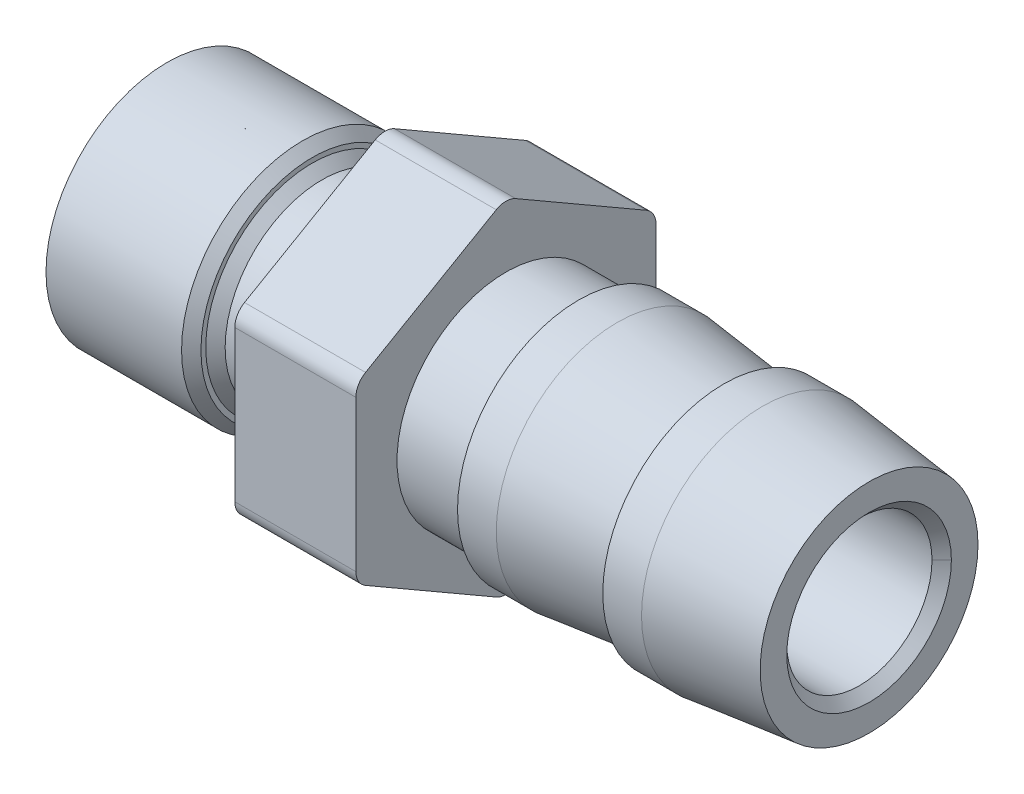
ISO-10303-21;
HEADER;
FILE_DESCRIPTION(('STEP AP214'),'2;1');
FILE_NAME('part.step','',(''),(''),'','','');
FILE_SCHEMA(('AUTOMOTIVE_DESIGN { 1 0 10303 214 1 1 1 1 }'));
ENDSEC;
DATA;
#1=APPLICATION_CONTEXT('core data for automotive mechanical design processes');
#2=APPLICATION_PROTOCOL_DEFINITION('international standard','automotive_design',2000,#1);
#3=PRODUCT_CONTEXT('',#1,'mechanical');
#4=PRODUCT('Part','Part','',(#3));
#5=PRODUCT_RELATED_PRODUCT_CATEGORY('part','',(#4));
#6=PRODUCT_DEFINITION_FORMATION('','',#4);
#7=PRODUCT_DEFINITION_CONTEXT('part definition',#1,'design');
#8=PRODUCT_DEFINITION('design','',#6,#7);
#9=PRODUCT_DEFINITION_SHAPE('','',#8);
#10=(LENGTH_UNIT() NAMED_UNIT(*) SI_UNIT(.MILLI.,.METRE.));
#11=(NAMED_UNIT(*) PLANE_ANGLE_UNIT() SI_UNIT($,.RADIAN.));
#12=(NAMED_UNIT(*) SI_UNIT($,.STERADIAN.) SOLID_ANGLE_UNIT());
#13=UNCERTAINTY_MEASURE_WITH_UNIT(LENGTH_MEASURE(1.E-05),#10,'distance_accuracy_value','');
#14=(GEOMETRIC_REPRESENTATION_CONTEXT(3) GLOBAL_UNCERTAINTY_ASSIGNED_CONTEXT((#13)) GLOBAL_UNIT_ASSIGNED_CONTEXT((#10,
#11,#12)) REPRESENTATION_CONTEXT('',''));
#15=CARTESIAN_POINT('',(0.,0.,0.));
#16=DIRECTION('',(0.,0.,1.));
#17=DIRECTION('',(1.,0.,0.));
#18=AXIS2_PLACEMENT_3D('',#15,#16,#17);
#19=CARTESIAN_POINT('',(10.,0.,0.));
#20=DIRECTION('',(1.,0.,0.));
#21=DIRECTION('',(0.,-1.,0.));
#22=AXIS2_PLACEMENT_3D('',#19,#20,#21);
#23=PLANE('',#22);
#24=CARTESIAN_POINT('',(10.,0.,0.));
#25=DIRECTION('',(-1.,0.,0.));
#26=DIRECTION('',(0.,0.,-1.));
#27=AXIS2_PLACEMENT_3D('',#24,#25,#26);
#28=CIRCLE('',#27,2.25);
#29=CARTESIAN_POINT('',(10.,0.,-2.25));
#30=VERTEX_POINT('',#29);
#31=EDGE_CURVE('E25',#30,#30,#28,.T.);
#32=ORIENTED_EDGE('',*,*,#31,.F.);
#33=EDGE_LOOP('',(#32));
#34=FACE_BOUND('',#33,.T.);
#35=CARTESIAN_POINT('',(10.,0.,0.));
#36=DIRECTION('',(-1.,0.,0.));
#37=DIRECTION('',(0.,0.,1.));
#38=AXIS2_PLACEMENT_3D('',#35,#36,#37);
#39=CIRCLE('',#38,1.7);
#40=CARTESIAN_POINT('',(10.,0.,1.7));
#41=VERTEX_POINT('',#40);
#42=CARTESIAN_POINT('',(10.,0.,-1.7));
#43=VERTEX_POINT('',#42);
#44=EDGE_CURVE('E44',#41,#43,#39,.T.);
#45=ORIENTED_EDGE('',*,*,#44,.T.);
#46=CARTESIAN_POINT('',(10.,0.,0.));
#47=DIRECTION('',(-1.,0.,0.));
#48=DIRECTION('',(0.,0.,-1.));
#49=AXIS2_PLACEMENT_3D('',#46,#47,#48);
#50=CIRCLE('',#49,1.7);
#51=EDGE_CURVE('E235',#43,#41,#50,.T.);
#52=ORIENTED_EDGE('',*,*,#51,.T.);
#53=EDGE_LOOP('',(#45,#52));
#54=FACE_BOUND('',#53,.T.);
#55=ADVANCED_FACE('F16',(#34,#54),#23,.T.);
#56=CARTESIAN_POINT('',(10.,0.,0.));
#57=DIRECTION('',(-1.,0.,0.));
#58=DIRECTION('',(0.,0.,-1.));
#59=AXIS2_PLACEMENT_3D('',#56,#57,#58);
#60=CONICAL_SURFACE('',#59,2.25,0.11315098159);
#61=ORIENTED_EDGE('',*,*,#31,.T.);
#62=DIRECTION('',(-0.993605254789754,0.,-0.112909688043972));
#63=VECTOR('',#62,1.);
#64=CARTESIAN_POINT('',(10.,0.,-2.25));
#65=LINE('',#64,#63);
#66=CARTESIAN_POINT('',(7.8,0.,-2.5));
#67=VERTEX_POINT('',#66);
#68=EDGE_CURVE('E10',#30,#67,#65,.T.);
#69=ORIENTED_EDGE('',*,*,#68,.T.);
#70=CARTESIAN_POINT('',(7.8,0.,0.));
#71=DIRECTION('',(-1.,0.,0.));
#72=DIRECTION('',(0.,0.,-1.));
#73=AXIS2_PLACEMENT_3D('',#70,#71,#72);
#74=CIRCLE('',#73,2.5);
#75=EDGE_CURVE('E281',#67,#67,#74,.T.);
#76=ORIENTED_EDGE('',*,*,#75,.F.);
#77=ORIENTED_EDGE('',*,*,#68,.F.);
#78=EDGE_LOOP('',(#61,#69,#76,#77));
#79=FACE_BOUND('',#78,.T.);
#80=ADVANCED_FACE('F18',(#79),#60,.T.);
#81=CARTESIAN_POINT('',(9.8,0.,0.));
#82=DIRECTION('',(1.,0.,0.));
#83=DIRECTION('',(0.,0.,1.));
#84=AXIS2_PLACEMENT_3D('',#81,#82,#83);
#85=CONICAL_SURFACE('',#84,1.5,0.785398163397);
#86=DIRECTION('',(0.707106781186548,0.,0.707106781186548));
#87=VECTOR('',#86,1.);
#88=CARTESIAN_POINT('',(9.8,0.,1.5));
#89=LINE('',#88,#87);
#90=CARTESIAN_POINT('',(9.8,0.,1.5));
#91=VERTEX_POINT('',#90);
#92=EDGE_CURVE('E232',#91,#41,#89,.T.);
#93=ORIENTED_EDGE('',*,*,#92,.F.);
#94=CARTESIAN_POINT('',(9.8,0.,0.));
#95=DIRECTION('',(-1.,0.,0.));
#96=DIRECTION('',(0.,0.,1.));
#97=AXIS2_PLACEMENT_3D('',#94,#95,#96);
#98=CIRCLE('',#97,1.5);
#99=CARTESIAN_POINT('',(9.8,0.,-1.5));
#100=VERTEX_POINT('',#99);
#101=EDGE_CURVE('E274',#91,#100,#98,.T.);
#102=ORIENTED_EDGE('',*,*,#101,.T.);
#103=DIRECTION('',(0.707106781186548,0.,-0.707106781186548));
#104=VECTOR('',#103,1.);
#105=CARTESIAN_POINT('',(9.8,0.,-1.5));
#106=LINE('',#105,#104);
#107=EDGE_CURVE('E230',#100,#43,#106,.T.);
#108=ORIENTED_EDGE('',*,*,#107,.T.);
#109=ORIENTED_EDGE('',*,*,#44,.F.);
#110=EDGE_LOOP('',(#93,#102,#108,#109));
#111=FACE_BOUND('',#110,.T.);
#112=ADVANCED_FACE('F304',(#111),#85,.F.);
#113=CARTESIAN_POINT('',(9.8,0.,0.));
#114=DIRECTION('',(1.,0.,0.));
#115=DIRECTION('',(0.,0.,-1.));
#116=AXIS2_PLACEMENT_3D('',#113,#114,#115);
#117=CONICAL_SURFACE('',#116,1.5,0.785398163397);
#118=ORIENTED_EDGE('',*,*,#107,.F.);
#119=CARTESIAN_POINT('',(9.8,0.,0.));
#120=DIRECTION('',(-1.,0.,0.));
#121=DIRECTION('',(0.,0.,-1.));
#122=AXIS2_PLACEMENT_3D('',#119,#120,#121);
#123=CIRCLE('',#122,1.5);
#124=EDGE_CURVE('E273',#100,#91,#123,.T.);
#125=ORIENTED_EDGE('',*,*,#124,.T.);
#126=ORIENTED_EDGE('',*,*,#92,.T.);
#127=ORIENTED_EDGE('',*,*,#51,.F.);
#128=EDGE_LOOP('',(#118,#125,#126,#127));
#129=FACE_BOUND('',#128,.T.);
#130=ADVANCED_FACE('F302',(#129),#117,.F.);
#131=CARTESIAN_POINT('',(7.8,0.,0.));
#132=DIRECTION('',(-1.,0.,0.));
#133=DIRECTION('',(0.,0.,-1.));
#134=AXIS2_PLACEMENT_3D('',#131,#132,#133);
#135=CYLINDRICAL_SURFACE('',#134,2.5);
#136=ORIENTED_EDGE('',*,*,#75,.T.);
#137=DIRECTION('',(-1.,0.,0.));
#138=VECTOR('',#137,1.);
#139=CARTESIAN_POINT('',(7.8,0.,-2.5));
#140=LINE('',#139,#138);
#141=CARTESIAN_POINT('',(7.,0.,-2.5));
#142=VERTEX_POINT('',#141);
#143=EDGE_CURVE('E285',#67,#142,#140,.T.);
#144=ORIENTED_EDGE('',*,*,#143,.T.);
#145=CARTESIAN_POINT('',(7.,0.,0.));
#146=DIRECTION('',(-1.,0.,0.));
#147=DIRECTION('',(0.,0.,-1.));
#148=AXIS2_PLACEMENT_3D('',#145,#146,#147);
#149=CIRCLE('',#148,2.5);
#150=EDGE_CURVE('E267',#142,#142,#149,.T.);
#151=ORIENTED_EDGE('',*,*,#150,.F.);
#152=ORIENTED_EDGE('',*,*,#143,.F.);
#153=EDGE_LOOP('',(#136,#144,#151,#152));
#154=FACE_BOUND('',#153,.T.);
#155=ADVANCED_FACE('F755',(#154),#135,.T.);
#156=CARTESIAN_POINT('',(0.,0.,0.));
#157=DIRECTION('',(-1.,0.,0.));
#158=DIRECTION('',(0.,1.,0.));
#159=AXIS2_PLACEMENT_3D('',#156,#157,#158);
#160=CYLINDRICAL_SURFACE('',#159,1.5);
#161=CARTESIAN_POINT('',(10.,0.,1.5));
#162=CARTESIAN_POINT('',(-4.5,0.,1.5));
#163=(BOUNDED_CURVE() B_SPLINE_CURVE(1,(#161,#162),.UNSPECIFIED.,.F.,
.F.) B_SPLINE_CURVE_WITH_KNOTS((2,2),(-10.,4.5),
.UNSPECIFIED.) CURVE() GEOMETRIC_REPRESENTATION_ITEM() RATIONAL_B_SPLINE_CURVE((1.,1.)) REPRESENTATION_ITEM(''));
#164=CARTESIAN_POINT('',(-4.5,0.,1.5));
#165=VERTEX_POINT('',#164);
#166=EDGE_CURVE('E268',#91,#165,#163,.T.);
#167=ORIENTED_EDGE('',*,*,#166,.F.);
#168=ORIENTED_EDGE('',*,*,#124,.F.);
#169=ORIENTED_EDGE('',*,*,#101,.F.);
#170=ORIENTED_EDGE('',*,*,#166,.T.);
#171=CARTESIAN_POINT('',(-4.5,0.,0.));
#172=DIRECTION('',(1.,0.,0.));
#173=DIRECTION('',(0.,0.,1.));
#174=AXIS2_PLACEMENT_3D('',#171,#172,#173);
#175=CIRCLE('',#174,1.5);
#176=EDGE_CURVE('E263',#165,#165,#175,.T.);
#177=ORIENTED_EDGE('',*,*,#176,.F.);
#178=EDGE_LOOP('',(#167,#168,#169,#170,#177));
#179=FACE_BOUND('',#178,.T.);
#180=ADVANCED_FACE('F753',(#179),#160,.F.);
#181=CARTESIAN_POINT('',(7.,0.,0.));
#182=DIRECTION('',(-1.,0.,0.));
#183=DIRECTION('',(0.,0.,1.));
#184=AXIS2_PLACEMENT_3D('',#181,#182,#183);
#185=PLANE('',#184);
#186=CARTESIAN_POINT('',(7.,0.,0.));
#187=DIRECTION('',(-1.,0.,0.));
#188=DIRECTION('',(0.,0.,-1.));
#189=AXIS2_PLACEMENT_3D('',#186,#187,#188);
#190=CIRCLE('',#189,2.25);
#191=CARTESIAN_POINT('',(7.,0.,-2.25));
#192=VERTEX_POINT('',#191);
#193=EDGE_CURVE('E258',#192,#192,#190,.T.);
#194=ORIENTED_EDGE('',*,*,#193,.F.);
#195=EDGE_LOOP('',(#194));
#196=FACE_BOUND('',#195,.T.);
#197=ORIENTED_EDGE('',*,*,#150,.T.);
#198=EDGE_LOOP('',(#197));
#199=FACE_BOUND('',#198,.T.);
#200=ADVANCED_FACE('F749',(#196,#199),#185,.T.);
#201=CARTESIAN_POINT('',(-4.5,0.,0.));
#202=DIRECTION('',(-1.,0.,0.));
#203=DIRECTION('',(0.,0.,1.));
#204=AXIS2_PLACEMENT_3D('',#201,#202,#203);
#205=PLANE('',#204);
#206=CARTESIAN_POINT('',(-4.5,0.,0.));
#207=DIRECTION('',(1.,0.,0.));
#208=DIRECTION('',(0.,0.,1.));
#209=AXIS2_PLACEMENT_3D('',#206,#207,#208);
#210=CIRCLE('',#209,2.5);
#211=CARTESIAN_POINT('',(-4.5,0.,2.5));
#212=VERTEX_POINT('',#211);
#213=EDGE_CURVE('E255',#212,#212,#210,.T.);
#214=ORIENTED_EDGE('',*,*,#213,.F.);
#215=EDGE_LOOP('',(#214));
#216=FACE_BOUND('',#215,.T.);
#217=ORIENTED_EDGE('',*,*,#176,.T.);
#218=EDGE_LOOP('',(#217));
#219=FACE_BOUND('',#218,.T.);
#220=ADVANCED_FACE('F745',(#216,#219),#205,.T.);
#221=CARTESIAN_POINT('',(7.,0.,0.));
#222=DIRECTION('',(-1.,0.,0.));
#223=DIRECTION('',(0.,0.,-1.));
#224=AXIS2_PLACEMENT_3D('',#221,#222,#223);
#225=CONICAL_SURFACE('',#224,2.25,0.11315098159);
#226=ORIENTED_EDGE('',*,*,#193,.T.);
#227=DIRECTION('',(-0.993605254789867,0.,-0.112909688042985));
#228=VECTOR('',#227,1.);
#229=CARTESIAN_POINT('',(7.,0.,-2.25));
#230=LINE('',#229,#228);
#231=CARTESIAN_POINT('',(4.8,0.,-2.499999999998));
#232=VERTEX_POINT('',#231);
#233=EDGE_CURVE('E262',#192,#232,#230,.T.);
#234=ORIENTED_EDGE('',*,*,#233,.T.);
#235=CARTESIAN_POINT('',(4.8,0.,0.));
#236=DIRECTION('',(-1.,0.,0.));
#237=DIRECTION('',(0.,0.,-1.));
#238=AXIS2_PLACEMENT_3D('',#235,#236,#237);
#239=CIRCLE('',#238,2.499999999998);
#240=EDGE_CURVE('E247',#232,#232,#239,.T.);
#241=ORIENTED_EDGE('',*,*,#240,.F.);
#242=ORIENTED_EDGE('',*,*,#233,.F.);
#243=EDGE_LOOP('',(#226,#234,#241,#242));
#244=FACE_BOUND('',#243,.T.);
#245=ADVANCED_FACE('F741',(#244),#225,.T.);
#246=CARTESIAN_POINT('',(-4.5,0.,0.));
#247=DIRECTION('',(1.,0.,0.));
#248=DIRECTION('',(0.,0.,1.));
#249=AXIS2_PLACEMENT_3D('',#246,#247,#248);
#250=CYLINDRICAL_SURFACE('',#249,2.5);
#251=DIRECTION('',(1.,0.,0.));
#252=VECTOR('',#251,1.);
#253=CARTESIAN_POINT('',(-4.5,0.,2.5));
#254=LINE('',#253,#252);
#255=CARTESIAN_POINT('',(-1.7,0.,2.5));
#256=VERTEX_POINT('',#255);
#257=EDGE_CURVE('E254',#212,#256,#254,.T.);
#258=ORIENTED_EDGE('',*,*,#257,.F.);
#259=ORIENTED_EDGE('',*,*,#213,.T.);
#260=ORIENTED_EDGE('',*,*,#257,.T.);
#261=CARTESIAN_POINT('',(-1.7,0.,0.));
#262=DIRECTION('',(1.,0.,0.));
#263=DIRECTION('',(0.,0.,1.));
#264=AXIS2_PLACEMENT_3D('',#261,#262,#263);
#265=CIRCLE('',#264,2.5);
#266=EDGE_CURVE('E243',#256,#256,#265,.T.);
#267=ORIENTED_EDGE('',*,*,#266,.F.);
#268=EDGE_LOOP('',(#258,#259,#260,#267));
#269=FACE_BOUND('',#268,.T.);
#270=ADVANCED_FACE('F737',(#269),#250,.T.);
#271=CARTESIAN_POINT('',(4.8,0.,0.));
#272=DIRECTION('',(-1.,0.,0.));
#273=DIRECTION('',(0.,0.,-1.));
#274=AXIS2_PLACEMENT_3D('',#271,#272,#273);
#275=CYLINDRICAL_SURFACE('',#274,2.499999999998);
#276=ORIENTED_EDGE('',*,*,#240,.T.);
#277=DIRECTION('',(-1.,0.,0.));
#278=VECTOR('',#277,1.);
#279=CARTESIAN_POINT('',(4.8,0.,-2.499999999998));
#280=LINE('',#279,#278);
#281=CARTESIAN_POINT('',(4.,0.,-2.499999999998));
#282=VERTEX_POINT('',#281);
#283=EDGE_CURVE('E251',#232,#282,#280,.T.);
#284=ORIENTED_EDGE('',*,*,#283,.T.);
#285=CARTESIAN_POINT('',(4.,0.,0.));
#286=DIRECTION('',(-1.,0.,0.));
#287=DIRECTION('',(0.,0.,-1.));
#288=AXIS2_PLACEMENT_3D('',#285,#286,#287);
#289=CIRCLE('',#288,2.499999999998);
#290=EDGE_CURVE('E224',#282,#282,#289,.T.);
#291=ORIENTED_EDGE('',*,*,#290,.F.);
#292=ORIENTED_EDGE('',*,*,#283,.F.);
#293=EDGE_LOOP('',(#276,#284,#291,#292));
#294=FACE_BOUND('',#293,.T.);
#295=ADVANCED_FACE('F733',(#294),#275,.T.);
#296=CARTESIAN_POINT('',(-1.7,0.,0.));
#297=DIRECTION('',(-1.,0.,0.));
#298=DIRECTION('',(0.,0.,1.));
#299=AXIS2_PLACEMENT_3D('',#296,#297,#298);
#300=CONICAL_SURFACE('',#299,2.5,0.785398163397);
#301=DIRECTION('',(0.707106781186548,0.,-0.707106781186548));
#302=VECTOR('',#301,1.);
#303=CARTESIAN_POINT('',(-1.7,0.,2.5));
#304=LINE('',#303,#302);
#305=CARTESIAN_POINT('',(-1.5,0.,2.3));
#306=VERTEX_POINT('',#305);
#307=EDGE_CURVE('E240',#256,#306,#304,.T.);
#308=ORIENTED_EDGE('',*,*,#307,.F.);
#309=ORIENTED_EDGE('',*,*,#266,.T.);
#310=ORIENTED_EDGE('',*,*,#307,.T.);
#311=CARTESIAN_POINT('',(-1.5,0.,0.));
#312=DIRECTION('',(1.,0.,0.));
#313=DIRECTION('',(0.,0.,1.));
#314=AXIS2_PLACEMENT_3D('',#311,#312,#313);
#315=CIRCLE('',#314,2.3);
#316=EDGE_CURVE('E216',#306,#306,#315,.T.);
#317=ORIENTED_EDGE('',*,*,#316,.F.);
#318=EDGE_LOOP('',(#308,#309,#310,#317));
#319=FACE_BOUND('',#318,.T.);
#320=ADVANCED_FACE('F730',(#319),#300,.T.);
#321=CARTESIAN_POINT('',(4.,0.,0.));
#322=DIRECTION('',(-1.,0.,0.));
#323=DIRECTION('',(0.,0.,1.));
#324=AXIS2_PLACEMENT_3D('',#321,#322,#323);
#325=PLANE('',#324);
#326=CARTESIAN_POINT('',(4.,0.,0.));
#327=DIRECTION('',(-1.,0.,0.));
#328=DIRECTION('',(0.,0.,-1.));
#329=AXIS2_PLACEMENT_3D('',#326,#327,#328);
#330=CIRCLE('',#329,2.25);
#331=CARTESIAN_POINT('',(4.,0.,-2.25));
#332=VERTEX_POINT('',#331);
#333=EDGE_CURVE('E210',#332,#332,#330,.T.);
#334=ORIENTED_EDGE('',*,*,#333,.F.);
#335=EDGE_LOOP('',(#334));
#336=FACE_BOUND('',#335,.T.);
#337=ORIENTED_EDGE('',*,*,#290,.T.);
#338=EDGE_LOOP('',(#337));
#339=FACE_BOUND('',#338,.T.);
#340=ADVANCED_FACE('F726',(#336,#339),#325,.T.);
#341=CARTESIAN_POINT('',(-1.5,0.,0.));
#342=DIRECTION('',(1.,0.,0.));
#343=DIRECTION('',(0.,-1.,0.));
#344=AXIS2_PLACEMENT_3D('',#341,#342,#343);
#345=PLANE('',#344);
#346=ORIENTED_EDGE('',*,*,#316,.T.);
#347=EDGE_LOOP('',(#346));
#348=FACE_BOUND('',#347,.T.);
#349=CARTESIAN_POINT('',(-1.5,0.,0.));
#350=DIRECTION('',(1.,0.,0.));
#351=DIRECTION('',(0.,0.,1.));
#352=AXIS2_PLACEMENT_3D('',#349,#350,#351);
#353=CIRCLE('',#352,2.2);
#354=CARTESIAN_POINT('',(-1.5,0.,2.2));
#355=VERTEX_POINT('',#354);
#356=EDGE_CURVE('E226',#355,#355,#353,.T.);
#357=ORIENTED_EDGE('',*,*,#356,.F.);
#358=EDGE_LOOP('',(#357));
#359=FACE_BOUND('',#358,.T.);
#360=ADVANCED_FACE('F723',(#348,#359),#345,.T.);
#361=CARTESIAN_POINT('',(0.,0.,0.));
#362=DIRECTION('',(1.,0.,0.));
#363=DIRECTION('',(0.,0.,-1.));
#364=AXIS2_PLACEMENT_3D('',#361,#362,#363);
#365=CYLINDRICAL_SURFACE('',#364,2.25);
#366=DIRECTION('',(1.,0.,0.));
#367=VECTOR('',#366,1.);
#368=CARTESIAN_POINT('',(0.,0.,-2.25));
#369=LINE('',#368,#367);
#370=CARTESIAN_POINT('',(2.5,0.,-2.25));
#371=VERTEX_POINT('',#370);
#372=EDGE_CURVE('E213',#371,#332,#369,.T.);
#373=ORIENTED_EDGE('',*,*,#372,.T.);
#374=ORIENTED_EDGE('',*,*,#333,.T.);
#375=ORIENTED_EDGE('',*,*,#372,.F.);
#376=CARTESIAN_POINT('',(2.5,0.,0.));
#377=DIRECTION('',(1.,0.,0.));
#378=DIRECTION('',(0.,0.,-1.));
#379=AXIS2_PLACEMENT_3D('',#376,#377,#378);
#380=CIRCLE('',#379,2.25);
#381=EDGE_CURVE('E609',#371,#371,#380,.T.);
#382=ORIENTED_EDGE('',*,*,#381,.T.);
#383=EDGE_LOOP('',(#373,#374,#375,#382));
#384=FACE_BOUND('',#383,.T.);
#385=ADVANCED_FACE('F211',(#384),#365,.T.);
#386=CARTESIAN_POINT('',(-1.3,0.,0.));
#387=DIRECTION('',(-1.,0.,0.));
#388=DIRECTION('',(0.,0.,1.));
#389=AXIS2_PLACEMENT_3D('',#386,#387,#388);
#390=CONICAL_SURFACE('',#389,2.,0.785398163397);
#391=DIRECTION('',(0.707106781186548,0.,-0.707106781186548));
#392=VECTOR('',#391,1.);
#393=CARTESIAN_POINT('',(-1.3,0.,2.));
#394=LINE('',#393,#392);
#395=CARTESIAN_POINT('',(-1.3,0.,2.));
#396=VERTEX_POINT('',#395);
#397=EDGE_CURVE('E632',#355,#396,#394,.T.);
#398=ORIENTED_EDGE('',*,*,#397,.F.);
#399=ORIENTED_EDGE('',*,*,#356,.T.);
#400=ORIENTED_EDGE('',*,*,#397,.T.);
#401=CARTESIAN_POINT('',(-1.3,0.,0.));
#402=DIRECTION('',(1.,0.,0.));
#403=DIRECTION('',(0.,0.,1.));
#404=AXIS2_PLACEMENT_3D('',#401,#402,#403);
#405=CIRCLE('',#404,2.);
#406=EDGE_CURVE('E558',#396,#396,#405,.T.);
#407=ORIENTED_EDGE('',*,*,#406,.F.);
#408=EDGE_LOOP('',(#398,#399,#400,#407));
#409=FACE_BOUND('',#408,.T.);
#410=ADVANCED_FACE('F722',(#409),#390,.T.);
#411=CARTESIAN_POINT('',(2.5,0.,0.));
#412=DIRECTION('',(1.,0.,0.));
#413=DIRECTION('',(0.,-1.,0.));
#414=AXIS2_PLACEMENT_3D('',#411,#412,#413);
#415=PLANE('',#414);
#416=ORIENTED_EDGE('',*,*,#381,.F.);
#417=EDGE_LOOP('',(#416));
#418=FACE_BOUND('',#417,.T.);
#419=DIRECTION('',(0.,-0.50000000000019,0.866025403784329));
#420=VECTOR('',#419,1.);
#421=CARTESIAN_POINT('',(2.5,3.579571668976,0.));
#422=LINE('',#421,#420);
#423=CARTESIAN_POINT('',(2.5,3.464101615138,0.2));
#424=VERTEX_POINT('',#423);
#425=CARTESIAN_POINT('',(2.5,1.905255888326,2.9));
#426=VERTEX_POINT('',#425);
#427=EDGE_CURVE('E425',#424,#426,#422,.T.);
#428=ORIENTED_EDGE('',*,*,#427,.T.);
#429=CARTESIAN_POINT('',(2.5,1.558845726812,2.7));
#430=DIRECTION('',(1.,0.,0.));
#431=DIRECTION('',(0.,-1.,0.));
#432=AXIS2_PLACEMENT_3D('',#429,#430,#431);
#433=CIRCLE('',#432,0.4);
#434=CARTESIAN_POINT('',(2.5,1.558845726812,3.1));
#435=VERTEX_POINT('',#434);
#436=EDGE_CURVE('E534',#426,#435,#433,.T.);
#437=ORIENTED_EDGE('',*,*,#436,.T.);
#438=DIRECTION('',(0.,-1.,0.));
#439=VECTOR('',#438,1.);
#440=CARTESIAN_POINT('',(2.5,1.789785834488,3.1));
#441=LINE('',#440,#439);
#442=CARTESIAN_POINT('',(2.5,-1.558845726812,3.1));
#443=VERTEX_POINT('',#442);
#444=EDGE_CURVE('E550',#435,#443,#441,.T.);
#445=ORIENTED_EDGE('',*,*,#444,.T.);
#446=CARTESIAN_POINT('',(2.5,-1.558845726812,2.7));
#447=DIRECTION('',(1.,0.,0.));
#448=DIRECTION('',(0.,-1.,0.));
#449=AXIS2_PLACEMENT_3D('',#446,#447,#448);
#450=CIRCLE('',#449,0.4);
#451=CARTESIAN_POINT('',(2.5,-1.905255888326,2.9));
#452=VERTEX_POINT('',#451);
#453=EDGE_CURVE('E575',#443,#452,#450,.T.);
#454=ORIENTED_EDGE('',*,*,#453,.T.);
#455=DIRECTION('',(0.,-0.50000000000019,-0.866025403784329));
#456=VECTOR('',#455,1.);
#457=CARTESIAN_POINT('',(2.5,-1.789785834488,3.1));
#458=LINE('',#457,#456);
#459=CARTESIAN_POINT('',(2.5,-3.464101615138,0.2));
#460=VERTEX_POINT('',#459);
#461=EDGE_CURVE('E602',#452,#460,#458,.T.);
#462=ORIENTED_EDGE('',*,*,#461,.T.);
#463=CARTESIAN_POINT('',(2.5,-3.117691453624,0.));
#464=DIRECTION('',(1.,0.,0.));
#465=DIRECTION('',(0.,-1.,0.));
#466=AXIS2_PLACEMENT_3D('',#463,#464,#465);
#467=CIRCLE('',#466,0.4);
#468=CARTESIAN_POINT('',(2.5,-3.464101615138,-0.2));
#469=VERTEX_POINT('',#468);
#470=EDGE_CURVE('E449',#460,#469,#467,.T.);
#471=ORIENTED_EDGE('',*,*,#470,.T.);
#472=DIRECTION('',(0.,0.50000000000019,-0.866025403784329));
#473=VECTOR('',#472,1.);
#474=CARTESIAN_POINT('',(2.5,-3.579571668976,0.));
#475=LINE('',#474,#473);
#476=CARTESIAN_POINT('',(2.5,-1.905255888326,-2.9));
#477=VERTEX_POINT('',#476);
#478=EDGE_CURVE('E454',#469,#477,#475,.T.);
#479=ORIENTED_EDGE('',*,*,#478,.T.);
#480=CARTESIAN_POINT('',(2.5,-1.558845726812,-2.7));
#481=DIRECTION('',(-1.,0.,0.));
#482=DIRECTION('',(0.,-1.,0.));
#483=AXIS2_PLACEMENT_3D('',#480,#481,#482);
#484=CIRCLE('',#483,0.4);
#485=CARTESIAN_POINT('',(2.5,-1.558845726812,-3.1));
#486=VERTEX_POINT('',#485);
#487=EDGE_CURVE('E618',#486,#477,#484,.T.);
#488=ORIENTED_EDGE('',*,*,#487,.F.);
#489=DIRECTION('',(0.,1.,0.));
#490=VECTOR('',#489,1.);
#491=CARTESIAN_POINT('',(2.5,-1.789785834488,-3.1));
#492=LINE('',#491,#490);
#493=CARTESIAN_POINT('',(2.5,1.558845726812,-3.1));
#494=VERTEX_POINT('',#493);
#495=EDGE_CURVE('E582',#486,#494,#492,.T.);
#496=ORIENTED_EDGE('',*,*,#495,.T.);
#497=CARTESIAN_POINT('',(2.5,1.558845726812,-2.7));
#498=DIRECTION('',(-1.,0.,0.));
#499=DIRECTION('',(0.,-1.,0.));
#500=AXIS2_PLACEMENT_3D('',#497,#498,#499);
#501=CIRCLE('',#500,0.4);
#502=CARTESIAN_POINT('',(2.5,1.905255888326,-2.9));
#503=VERTEX_POINT('',#502);
#504=EDGE_CURVE('E491',#503,#494,#501,.T.);
#505=ORIENTED_EDGE('',*,*,#504,.F.);
#506=DIRECTION('',(0.,0.50000000000019,0.866025403784329));
#507=VECTOR('',#506,1.);
#508=CARTESIAN_POINT('',(2.5,1.789785834488,-3.1));
#509=LINE('',#508,#507);
#510=CARTESIAN_POINT('',(2.5,3.464101615138,-0.2));
#511=VERTEX_POINT('',#510);
#512=EDGE_CURVE('E526',#503,#511,#509,.T.);
#513=ORIENTED_EDGE('',*,*,#512,.T.);
#514=CARTESIAN_POINT('',(2.5,3.117691453624,0.));
#515=DIRECTION('',(-1.,0.,0.));
#516=DIRECTION('',(0.,-1.,0.));
#517=AXIS2_PLACEMENT_3D('',#514,#515,#516);
#518=CIRCLE('',#517,0.4);
#519=EDGE_CURVE('E424',#424,#511,#518,.T.);
#520=ORIENTED_EDGE('',*,*,#519,.F.);
#521=EDGE_LOOP('',(#428,#437,#445,#454,#462,#471,#479,#488,#496,#505,#513,#520));
#522=FACE_BOUND('',#521,.T.);
#523=ADVANCED_FACE('F677',(#418,#522),#415,.T.);
#524=CARTESIAN_POINT('',(-1.5,0.,0.));
#525=DIRECTION('',(1.,0.,0.));
#526=DIRECTION('',(0.,0.,1.));
#527=AXIS2_PLACEMENT_3D('',#524,#525,#526);
#528=CYLINDRICAL_SURFACE('',#527,2.);
#529=DIRECTION('',(1.,0.,0.));
#530=VECTOR('',#529,1.);
#531=CARTESIAN_POINT('',(-1.5,0.,2.));
#532=LINE('',#531,#530);
#533=CARTESIAN_POINT('',(0.,0.,2.));
#534=VERTEX_POINT('',#533);
#535=EDGE_CURVE('E554',#396,#534,#532,.T.);
#536=ORIENTED_EDGE('',*,*,#535,.F.);
#537=ORIENTED_EDGE('',*,*,#406,.T.);
#538=ORIENTED_EDGE('',*,*,#535,.T.);
#539=CARTESIAN_POINT('',(0.,0.,0.));
#540=DIRECTION('',(1.,0.,0.));
#541=DIRECTION('',(0.,0.,1.));
#542=AXIS2_PLACEMENT_3D('',#539,#540,#541);
#543=CIRCLE('',#542,2.);
#544=EDGE_CURVE('E471',#534,#534,#543,.T.);
#545=ORIENTED_EDGE('',*,*,#544,.F.);
#546=EDGE_LOOP('',(#536,#537,#538,#545));
#547=FACE_BOUND('',#546,.T.);
#548=ADVANCED_FACE('F708',(#547),#528,.T.);
#549=CARTESIAN_POINT('',(0.,-3.579571668976,0.));
#550=DIRECTION('',(0.,0.866025403784329,0.50000000000019));
#551=DIRECTION('',(1.,0.,0.));
#552=AXIS2_PLACEMENT_3D('',#549,#550,#551);
#553=PLANE('',#552);
#554=DIRECTION('',(1.,0.,0.));
#555=VECTOR('',#554,1.);
#556=CARTESIAN_POINT('',(0.,-1.905255888326,-2.9));
#557=LINE('',#556,#555);
#558=CARTESIAN_POINT('',(0.,-1.905255888326,-2.9));
#559=VERTEX_POINT('',#558);
#560=EDGE_CURVE('E613',#559,#477,#557,.T.);
#561=ORIENTED_EDGE('',*,*,#560,.T.);
#562=ORIENTED_EDGE('',*,*,#478,.F.);
#563=DIRECTION('',(1.,0.,0.));
#564=VECTOR('',#563,1.);
#565=CARTESIAN_POINT('',(0.,-3.464101615138,-0.2));
#566=LINE('',#565,#564);
#567=CARTESIAN_POINT('',(0.,-3.464101615138,-0.2));
#568=VERTEX_POINT('',#567);
#569=EDGE_CURVE('E455',#568,#469,#566,.T.);
#570=ORIENTED_EDGE('',*,*,#569,.F.);
#571=DIRECTION('',(0.,0.50000000000019,-0.866025403784329));
#572=VECTOR('',#571,1.);
#573=CARTESIAN_POINT('',(0.,-3.579571668976,0.));
#574=LINE('',#573,#572);
#575=EDGE_CURVE('E390',#568,#559,#574,.T.);
#576=ORIENTED_EDGE('',*,*,#575,.T.);
#577=EDGE_LOOP('',(#561,#562,#570,#576));
#578=FACE_BOUND('',#577,.T.);
#579=ADVANCED_FACE('F706',(#578),#553,.F.);
#580=CARTESIAN_POINT('',(0.,-3.117691453624,0.));
#581=DIRECTION('',(1.,0.,0.));
#582=DIRECTION('',(0.,-0.866025403784329,0.50000000000019));
#583=AXIS2_PLACEMENT_3D('',#580,#581,#582);
#584=CYLINDRICAL_SURFACE('',#583,0.4);
#585=CARTESIAN_POINT('',(0.,-3.117691453624,0.));
#586=DIRECTION('',(1.,0.,0.));
#587=DIRECTION('',(0.,-1.,0.));
#588=AXIS2_PLACEMENT_3D('',#585,#586,#587);
#589=CIRCLE('',#588,0.4);
#590=CARTESIAN_POINT('',(0.,-3.464101615138,0.2));
#591=VERTEX_POINT('',#590);
#592=EDGE_CURVE('E438',#591,#568,#589,.T.);
#593=ORIENTED_EDGE('',*,*,#592,.T.);
#594=ORIENTED_EDGE('',*,*,#569,.T.);
#595=ORIENTED_EDGE('',*,*,#470,.F.);
#596=DIRECTION('',(1.,0.,0.));
#597=VECTOR('',#596,1.);
#598=CARTESIAN_POINT('',(0.,-3.464101615138,0.2));
#599=LINE('',#598,#597);
#600=EDGE_CURVE('E595',#591,#460,#599,.T.);
#601=ORIENTED_EDGE('',*,*,#600,.F.);
#602=EDGE_LOOP('',(#593,#594,#595,#601));
#603=FACE_BOUND('',#602,.T.);
#604=ADVANCED_FACE('F675',(#603),#584,.T.);
#605=CARTESIAN_POINT('',(0.,-1.558845726812,-2.7));
#606=DIRECTION('',(1.,0.,0.));
#607=DIRECTION('',(0.,0.,-1.));
#608=AXIS2_PLACEMENT_3D('',#605,#606,#607);
#609=CYLINDRICAL_SURFACE('',#608,0.4);
#610=DIRECTION('',(1.,0.,0.));
#611=VECTOR('',#610,1.);
#612=CARTESIAN_POINT('',(0.,-1.558845726812,-3.1));
#613=LINE('',#612,#611);
#614=CARTESIAN_POINT('',(0.,-1.558845726812,-3.1));
#615=VERTEX_POINT('',#614);
#616=EDGE_CURVE('E588',#615,#486,#613,.T.);
#617=ORIENTED_EDGE('',*,*,#616,.T.);
#618=ORIENTED_EDGE('',*,*,#487,.T.);
#619=ORIENTED_EDGE('',*,*,#560,.F.);
#620=CARTESIAN_POINT('',(0.,-1.558845726812,-2.7));
#621=DIRECTION('',(-1.,0.,0.));
#622=DIRECTION('',(0.,-1.,0.));
#623=AXIS2_PLACEMENT_3D('',#620,#621,#622);
#624=CIRCLE('',#623,0.4);
#625=EDGE_CURVE('E385',#615,#559,#624,.T.);
#626=ORIENTED_EDGE('',*,*,#625,.F.);
#627=EDGE_LOOP('',(#617,#618,#619,#626));
#628=FACE_BOUND('',#627,.T.);
#629=ADVANCED_FACE('F704',(#628),#609,.T.);
#630=CARTESIAN_POINT('',(0.,-1.789785834488,3.1));
#631=DIRECTION('',(0.,0.866025403784329,-0.50000000000019));
#632=DIRECTION('',(-1.,0.,0.));
#633=AXIS2_PLACEMENT_3D('',#630,#631,#632);
#634=PLANE('',#633);
#635=ORIENTED_EDGE('',*,*,#600,.T.);
#636=ORIENTED_EDGE('',*,*,#461,.F.);
#637=DIRECTION('',(1.,0.,0.));
#638=VECTOR('',#637,1.);
#639=CARTESIAN_POINT('',(0.,-1.905255888326,2.9));
#640=LINE('',#639,#638);
#641=CARTESIAN_POINT('',(0.,-1.905255888326,2.9));
#642=VERTEX_POINT('',#641);
#643=EDGE_CURVE('E490',#642,#452,#640,.T.);
#644=ORIENTED_EDGE('',*,*,#643,.F.);
#645=DIRECTION('',(0.,-0.50000000000019,-0.866025403784329));
#646=VECTOR('',#645,1.);
#647=CARTESIAN_POINT('',(0.,-1.789785834488,3.1));
#648=LINE('',#647,#646);
#649=EDGE_CURVE('E445',#642,#591,#648,.T.);
#650=ORIENTED_EDGE('',*,*,#649,.T.);
#651=EDGE_LOOP('',(#635,#636,#644,#650));
#652=FACE_BOUND('',#651,.T.);
#653=ADVANCED_FACE('F669',(#652),#634,.F.);
#654=CARTESIAN_POINT('',(0.,-1.789785834488,-3.1));
#655=DIRECTION('',(0.,0.,1.));
#656=DIRECTION('',(0.,-1.,0.));
#657=AXIS2_PLACEMENT_3D('',#654,#655,#656);
#658=PLANE('',#657);
#659=DIRECTION('',(1.,0.,0.));
#660=VECTOR('',#659,1.);
#661=CARTESIAN_POINT('',(0.,1.558845726812,-3.1));
#662=LINE('',#661,#660);
#663=CARTESIAN_POINT('',(0.,1.558845726812,-3.1));
#664=VERTEX_POINT('',#663);
#665=EDGE_CURVE('E485',#664,#494,#662,.T.);
#666=ORIENTED_EDGE('',*,*,#665,.T.);
#667=ORIENTED_EDGE('',*,*,#495,.F.);
#668=ORIENTED_EDGE('',*,*,#616,.F.);
#669=DIRECTION('',(0.,1.,0.));
#670=VECTOR('',#669,1.);
#671=CARTESIAN_POINT('',(0.,-1.789785834488,-3.1));
#672=LINE('',#671,#670);
#673=EDGE_CURVE('E391',#615,#664,#672,.T.);
#674=ORIENTED_EDGE('',*,*,#673,.T.);
#675=EDGE_LOOP('',(#666,#667,#668,#674));
#676=FACE_BOUND('',#675,.T.);
#677=ADVANCED_FACE('F701',(#676),#658,.F.);
#678=CARTESIAN_POINT('',(0.,-1.558845726812,2.7));
#679=DIRECTION('',(1.,0.,0.));
#680=DIRECTION('',(0.,0.,1.));
#681=AXIS2_PLACEMENT_3D('',#678,#679,#680);
#682=CYLINDRICAL_SURFACE('',#681,0.4);
#683=CARTESIAN_POINT('',(0.,-1.558845726812,2.7));
#684=DIRECTION('',(1.,0.,0.));
#685=DIRECTION('',(0.,-1.,0.));
#686=AXIS2_PLACEMENT_3D('',#683,#684,#685);
#687=CIRCLE('',#686,0.4);
#688=CARTESIAN_POINT('',(0.,-1.558845726812,3.1));
#689=VERTEX_POINT('',#688);
#690=EDGE_CURVE('E466',#689,#642,#687,.T.);
#691=ORIENTED_EDGE('',*,*,#690,.T.);
#692=ORIENTED_EDGE('',*,*,#643,.T.);
#693=ORIENTED_EDGE('',*,*,#453,.F.);
#694=DIRECTION('',(1.,0.,0.));
#695=VECTOR('',#694,1.);
#696=CARTESIAN_POINT('',(0.,-1.558845726812,3.1));
#697=LINE('',#696,#695);
#698=EDGE_CURVE('E525',#689,#443,#697,.T.);
#699=ORIENTED_EDGE('',*,*,#698,.F.);
#700=EDGE_LOOP('',(#691,#692,#693,#699));
#701=FACE_BOUND('',#700,.T.);
#702=ADVANCED_FACE('F679',(#701),#682,.T.);
#703=CARTESIAN_POINT('',(0.,1.558845726812,-2.7));
#704=DIRECTION('',(1.,0.,0.));
#705=DIRECTION('',(0.,0.866025403784329,-0.50000000000019));
#706=AXIS2_PLACEMENT_3D('',#703,#704,#705);
#707=CYLINDRICAL_SURFACE('',#706,0.4);
#708=DIRECTION('',(1.,0.,0.));
#709=VECTOR('',#708,1.);
#710=CARTESIAN_POINT('',(0.,1.905255888326,-2.9));
#711=LINE('',#710,#709);
#712=CARTESIAN_POINT('',(0.,1.905255888326,-2.9));
#713=VERTEX_POINT('',#712);
#714=EDGE_CURVE('E520',#713,#503,#711,.T.);
#715=ORIENTED_EDGE('',*,*,#714,.T.);
#716=ORIENTED_EDGE('',*,*,#504,.T.);
#717=ORIENTED_EDGE('',*,*,#665,.F.);
#718=CARTESIAN_POINT('',(0.,1.558845726812,-2.7));
#719=DIRECTION('',(-1.,0.,0.));
#720=DIRECTION('',(0.,-1.,0.));
#721=AXIS2_PLACEMENT_3D('',#718,#719,#720);
#722=CIRCLE('',#721,0.4);
#723=EDGE_CURVE('E410',#713,#664,#722,.T.);
#724=ORIENTED_EDGE('',*,*,#723,.F.);
#725=EDGE_LOOP('',(#715,#716,#717,#724));
#726=FACE_BOUND('',#725,.T.);
#727=ADVANCED_FACE('F698',(#726),#707,.T.);
#728=CARTESIAN_POINT('',(0.,1.789785834488,3.1));
#729=DIRECTION('',(0.,0.,-1.));
#730=DIRECTION('',(0.,-1.,0.));
#731=AXIS2_PLACEMENT_3D('',#728,#729,#730);
#732=PLANE('',#731);
#733=ORIENTED_EDGE('',*,*,#698,.T.);
#734=ORIENTED_EDGE('',*,*,#444,.F.);
#735=DIRECTION('',(1.,0.,0.));
#736=VECTOR('',#735,1.);
#737=CARTESIAN_POINT('',(0.,1.558845726812,3.1));
#738=LINE('',#737,#736);
#739=CARTESIAN_POINT('',(0.,1.558845726812,3.1));
#740=VERTEX_POINT('',#739);
#741=EDGE_CURVE('E516',#740,#435,#738,.T.);
#742=ORIENTED_EDGE('',*,*,#741,.F.);
#743=DIRECTION('',(0.,-1.,0.));
#744=VECTOR('',#743,1.);
#745=CARTESIAN_POINT('',(0.,1.789785834488,3.1));
#746=LINE('',#745,#744);
#747=EDGE_CURVE('E460',#740,#689,#746,.T.);
#748=ORIENTED_EDGE('',*,*,#747,.T.);
#749=EDGE_LOOP('',(#733,#734,#742,#748));
#750=FACE_BOUND('',#749,.T.);
#751=ADVANCED_FACE('F683',(#750),#732,.F.);
#752=CARTESIAN_POINT('',(0.,1.789785834488,-3.1));
#753=DIRECTION('',(0.,-0.866025403784329,0.50000000000019));
#754=DIRECTION('',(-1.,0.,0.));
#755=AXIS2_PLACEMENT_3D('',#752,#753,#754);
#756=PLANE('',#755);
#757=DIRECTION('',(1.,0.,0.));
#758=VECTOR('',#757,1.);
#759=CARTESIAN_POINT('',(0.,3.464101615138,-0.2));
#760=LINE('',#759,#758);
#761=CARTESIAN_POINT('',(0.,3.464101615138,-0.2));
#762=VERTEX_POINT('',#761);
#763=EDGE_CURVE('E509',#762,#511,#760,.T.);
#764=ORIENTED_EDGE('',*,*,#763,.T.);
#765=ORIENTED_EDGE('',*,*,#512,.F.);
#766=ORIENTED_EDGE('',*,*,#714,.F.);
#767=DIRECTION('',(0.,0.50000000000019,0.866025403784329));
#768=VECTOR('',#767,1.);
#769=CARTESIAN_POINT('',(0.,1.789785834488,-3.1));
#770=LINE('',#769,#768);
#771=EDGE_CURVE('E401',#713,#762,#770,.T.);
#772=ORIENTED_EDGE('',*,*,#771,.T.);
#773=EDGE_LOOP('',(#764,#765,#766,#772));
#774=FACE_BOUND('',#773,.T.);
#775=ADVANCED_FACE('F696',(#774),#756,.F.);
#776=CARTESIAN_POINT('',(0.,1.558845726812,2.7));
#777=DIRECTION('',(1.,0.,0.));
#778=DIRECTION('',(0.,0.866025403784329,0.50000000000019));
#779=AXIS2_PLACEMENT_3D('',#776,#777,#778);
#780=CYLINDRICAL_SURFACE('',#779,0.4);
#781=CARTESIAN_POINT('',(0.,1.558845726812,2.7));
#782=DIRECTION('',(1.,0.,0.));
#783=DIRECTION('',(0.,-1.,0.));
#784=AXIS2_PLACEMENT_3D('',#781,#782,#783);
#785=CIRCLE('',#784,0.4);
#786=CARTESIAN_POINT('',(0.,1.905255888326,2.9));
#787=VERTEX_POINT('',#786);
#788=EDGE_CURVE('E465',#787,#740,#785,.T.);
#789=ORIENTED_EDGE('',*,*,#788,.T.);
#790=ORIENTED_EDGE('',*,*,#741,.T.);
#791=ORIENTED_EDGE('',*,*,#436,.F.);
#792=DIRECTION('',(1.,0.,0.));
#793=VECTOR('',#792,1.);
#794=CARTESIAN_POINT('',(0.,1.905255888326,2.9));
#795=LINE('',#794,#793);
#796=EDGE_CURVE('E476',#787,#426,#795,.T.);
#797=ORIENTED_EDGE('',*,*,#796,.F.);
#798=EDGE_LOOP('',(#789,#790,#791,#797));
#799=FACE_BOUND('',#798,.T.);
#800=ADVANCED_FACE('F685',(#799),#780,.T.);
#801=CARTESIAN_POINT('',(0.,3.117691453624,0.));
#802=DIRECTION('',(1.,0.,0.));
#803=DIRECTION('',(0.,0.866025403784329,0.50000000000019));
#804=AXIS2_PLACEMENT_3D('',#801,#802,#803);
#805=CYLINDRICAL_SURFACE('',#804,0.4);
#806=DIRECTION('',(1.,0.,0.));
#807=VECTOR('',#806,1.);
#808=CARTESIAN_POINT('',(0.,3.464101615138,0.2));
#809=LINE('',#808,#807);
#810=CARTESIAN_POINT('',(0.,3.464101615138,0.2));
#811=VERTEX_POINT('',#810);
#812=EDGE_CURVE('E419',#811,#424,#809,.T.);
#813=ORIENTED_EDGE('',*,*,#812,.T.);
#814=ORIENTED_EDGE('',*,*,#519,.T.);
#815=ORIENTED_EDGE('',*,*,#763,.F.);
#816=CARTESIAN_POINT('',(0.,3.117691453624,0.));
#817=DIRECTION('',(-1.,0.,0.));
#818=DIRECTION('',(0.,-1.,0.));
#819=AXIS2_PLACEMENT_3D('',#816,#817,#818);
#820=CIRCLE('',#819,0.4);
#821=EDGE_CURVE('E396',#811,#762,#820,.T.);
#822=ORIENTED_EDGE('',*,*,#821,.F.);
#823=EDGE_LOOP('',(#813,#814,#815,#822));
#824=FACE_BOUND('',#823,.T.);
#825=ADVANCED_FACE('F691',(#824),#805,.T.);
#826=CARTESIAN_POINT('',(0.,3.579571668976,0.));
#827=DIRECTION('',(0.,-0.866025403784329,-0.50000000000019));
#828=DIRECTION('',(0.,0.50000000000019,-0.866025403784329));
#829=AXIS2_PLACEMENT_3D('',#826,#827,#828);
#830=PLANE('',#829);
#831=ORIENTED_EDGE('',*,*,#796,.T.);
#832=ORIENTED_EDGE('',*,*,#427,.F.);
#833=ORIENTED_EDGE('',*,*,#812,.F.);
#834=DIRECTION('',(0.,-0.50000000000019,0.866025403784329));
#835=VECTOR('',#834,1.);
#836=CARTESIAN_POINT('',(0.,3.579571668976,0.));
#837=LINE('',#836,#835);
#838=EDGE_CURVE('E402',#811,#787,#837,.T.);
#839=ORIENTED_EDGE('',*,*,#838,.T.);
#840=EDGE_LOOP('',(#831,#832,#833,#839));
#841=FACE_BOUND('',#840,.T.);
#842=ADVANCED_FACE('F687',(#841),#830,.F.);
#843=CARTESIAN_POINT('',(0.,0.,0.));
#844=DIRECTION('',(-1.,0.,0.));
#845=DIRECTION('',(0.,0.,1.));
#846=AXIS2_PLACEMENT_3D('',#843,#844,#845);
#847=PLANE('',#846);
#848=ORIENTED_EDGE('',*,*,#544,.T.);
#849=EDGE_LOOP('',(#848));
#850=FACE_BOUND('',#849,.T.);
#851=ORIENTED_EDGE('',*,*,#838,.F.);
#852=ORIENTED_EDGE('',*,*,#821,.T.);
#853=ORIENTED_EDGE('',*,*,#771,.F.);
#854=ORIENTED_EDGE('',*,*,#723,.T.);
#855=ORIENTED_EDGE('',*,*,#673,.F.);
#856=ORIENTED_EDGE('',*,*,#625,.T.);
#857=ORIENTED_EDGE('',*,*,#575,.F.);
#858=ORIENTED_EDGE('',*,*,#592,.F.);
#859=ORIENTED_EDGE('',*,*,#649,.F.);
#860=ORIENTED_EDGE('',*,*,#690,.F.);
#861=ORIENTED_EDGE('',*,*,#747,.F.);
#862=ORIENTED_EDGE('',*,*,#788,.F.);
#863=EDGE_LOOP('',(#851,#852,#853,#854,#855,#856,#857,#858,#859,#860,#861,#862));
#864=FACE_BOUND('',#863,.T.);
#865=ADVANCED_FACE('F673',(#850,#864),#847,.T.);
#866=CLOSED_SHELL('',(#55,#80,#112,#130,#155,#180,#200,#220,#245,#270,#295,#320,#340,#360,#385,
#410,#523,#548,#579,#604,#629,#653,#677,#702,#727,#751,#775,#800,#825,#842,#865));
#867=MANIFOLD_SOLID_BREP('B1',#866);
#868=ADVANCED_BREP_SHAPE_REPRESENTATION('',(#18,#867),#14);
#869=SHAPE_DEFINITION_REPRESENTATION(#9,#868);
ENDSEC;
END-ISO-10303-21;
